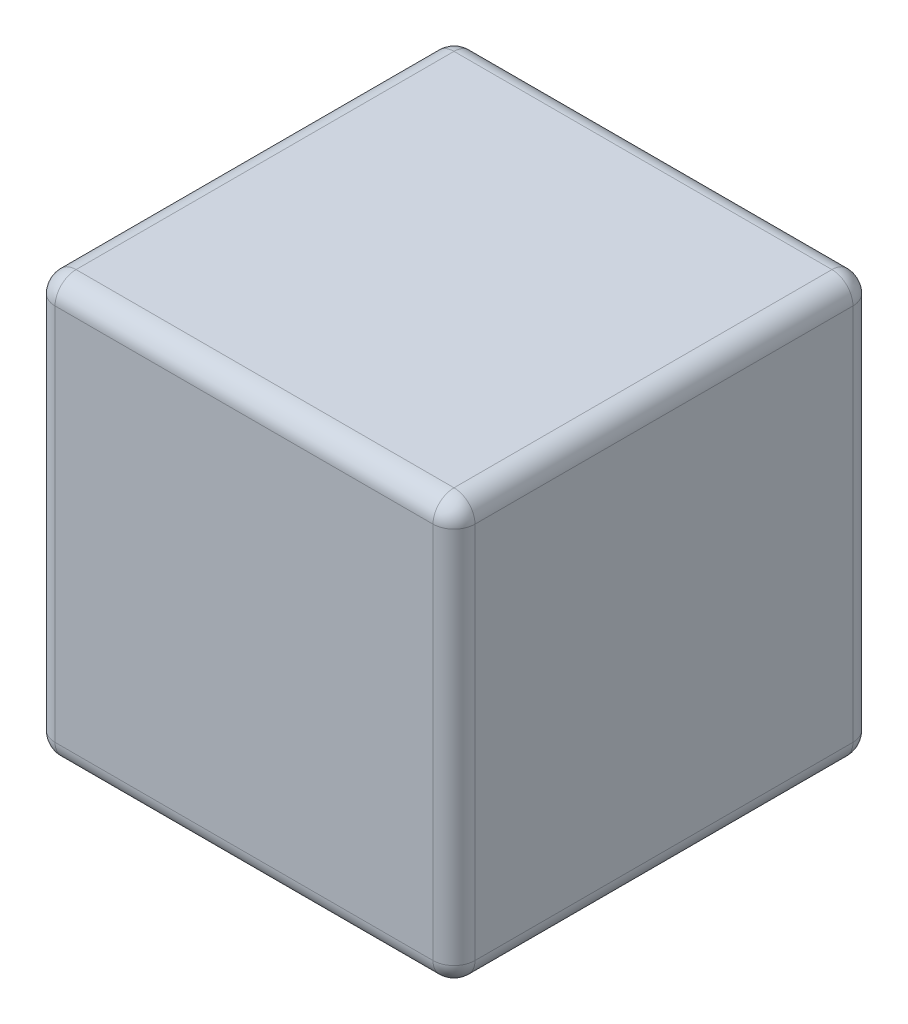
ISO-10303-21;
HEADER;
FILE_DESCRIPTION(('STEP AP214'),'2;1');
FILE_NAME('part.step','',(''),(''),'','','');
FILE_SCHEMA(('AUTOMOTIVE_DESIGN { 1 0 10303 214 1 1 1 1 }'));
ENDSEC;
DATA;
#1=APPLICATION_CONTEXT('core data for automotive mechanical design processes');
#2=APPLICATION_PROTOCOL_DEFINITION('international standard','automotive_design',2000,#1);
#3=PRODUCT_CONTEXT('',#1,'mechanical');
#4=PRODUCT('Part','Part','',(#3));
#5=PRODUCT_RELATED_PRODUCT_CATEGORY('part','',(#4));
#6=PRODUCT_DEFINITION_FORMATION('','',#4);
#7=PRODUCT_DEFINITION_CONTEXT('part definition',#1,'design');
#8=PRODUCT_DEFINITION('design','',#6,#7);
#9=PRODUCT_DEFINITION_SHAPE('','',#8);
#10=(LENGTH_UNIT() NAMED_UNIT(*) SI_UNIT(.MILLI.,.METRE.));
#11=(NAMED_UNIT(*) PLANE_ANGLE_UNIT() SI_UNIT($,.RADIAN.));
#12=(NAMED_UNIT(*) SI_UNIT($,.STERADIAN.) SOLID_ANGLE_UNIT());
#13=UNCERTAINTY_MEASURE_WITH_UNIT(LENGTH_MEASURE(1.E-05),#10,'distance_accuracy_value','');
#14=(GEOMETRIC_REPRESENTATION_CONTEXT(3) GLOBAL_UNCERTAINTY_ASSIGNED_CONTEXT((#13)) GLOBAL_UNIT_ASSIGNED_CONTEXT((#10,
#11,#12)) REPRESENTATION_CONTEXT('',''));
#15=CARTESIAN_POINT('',(0.,0.,0.));
#16=DIRECTION('',(0.,0.,1.));
#17=DIRECTION('',(1.,0.,0.));
#18=AXIS2_PLACEMENT_3D('',#15,#16,#17);
#19=CARTESIAN_POINT('',(0.,100.,0.));
#20=DIRECTION('',(1.,0.,0.));
#21=DIRECTION('',(0.,0.,-1.));
#22=AXIS2_PLACEMENT_3D('',#19,#20,#21);
#23=PLANE('',#22);
#24=DIRECTION('',(0.,0.,1.));
#25=VECTOR('',#24,1.);
#26=CARTESIAN_POINT('',(0.,95.,0.));
#27=LINE('',#26,#25);
#28=CARTESIAN_POINT('',(0.,95.,-5.));
#29=VERTEX_POINT('',#28);
#30=CARTESIAN_POINT('',(0.,95.,-95.));
#31=VERTEX_POINT('',#30);
#32=EDGE_CURVE('E195',#29,#31,#27,.F.);
#33=ORIENTED_EDGE('',*,*,#32,.T.);
#34=DIRECTION('',(0.,-1.,0.));
#35=VECTOR('',#34,1.);
#36=CARTESIAN_POINT('',(0.,100.,-95.));
#37=LINE('',#36,#35);
#38=CARTESIAN_POINT('',(0.,5.,-95.));
#39=VERTEX_POINT('',#38);
#40=EDGE_CURVE('E197',#31,#39,#37,.T.);
#41=ORIENTED_EDGE('',*,*,#40,.T.);
#42=DIRECTION('',(0.,0.,1.));
#43=VECTOR('',#42,1.);
#44=CARTESIAN_POINT('',(0.,5.,0.));
#45=LINE('',#44,#43);
#46=CARTESIAN_POINT('',(0.,5.,-5.));
#47=VERTEX_POINT('',#46);
#48=EDGE_CURVE('E193',#39,#47,#45,.T.);
#49=ORIENTED_EDGE('',*,*,#48,.T.);
#50=DIRECTION('',(0.,-1.,0.));
#51=VECTOR('',#50,1.);
#52=CARTESIAN_POINT('',(0.,100.,-5.));
#53=LINE('',#52,#51);
#54=EDGE_CURVE('E191',#47,#29,#53,.F.);
#55=ORIENTED_EDGE('',*,*,#54,.T.);
#56=EDGE_LOOP('',(#33,#41,#49,#55));
#57=FACE_BOUND('',#56,.T.);
#58=ADVANCED_FACE('F37',(#57),#23,.F.);
#59=CARTESIAN_POINT('',(0.,100.,0.));
#60=DIRECTION('',(0.,0.,-1.));
#61=DIRECTION('',(-1.,0.,0.));
#62=AXIS2_PLACEMENT_3D('',#59,#60,#61);
#63=PLANE('',#62);
#64=DIRECTION('',(1.,0.,0.));
#65=VECTOR('',#64,1.);
#66=CARTESIAN_POINT('',(0.,95.,0.));
#67=LINE('',#66,#65);
#68=CARTESIAN_POINT('',(95.,95.,0.));
#69=VERTEX_POINT('',#68);
#70=CARTESIAN_POINT('',(5.,95.,0.));
#71=VERTEX_POINT('',#70);
#72=EDGE_CURVE('E46',#69,#71,#67,.F.);
#73=ORIENTED_EDGE('',*,*,#72,.T.);
#74=DIRECTION('',(0.,-1.,0.));
#75=VECTOR('',#74,1.);
#76=CARTESIAN_POINT('',(5.,100.,0.));
#77=LINE('',#76,#75);
#78=CARTESIAN_POINT('',(5.,5.,0.));
#79=VERTEX_POINT('',#78);
#80=EDGE_CURVE('E11',#71,#79,#77,.T.);
#81=ORIENTED_EDGE('',*,*,#80,.T.);
#82=DIRECTION('',(1.,0.,0.));
#83=VECTOR('',#82,1.);
#84=CARTESIAN_POINT('',(100.,5.,0.));
#85=LINE('',#84,#83);
#86=CARTESIAN_POINT('',(95.,5.,0.));
#87=VERTEX_POINT('',#86);
#88=EDGE_CURVE('E200',#79,#87,#85,.T.);
#89=ORIENTED_EDGE('',*,*,#88,.T.);
#90=DIRECTION('',(0.,-1.,0.));
#91=VECTOR('',#90,1.);
#92=CARTESIAN_POINT('',(95.,100.,0.));
#93=LINE('',#92,#91);
#94=EDGE_CURVE('E57',#87,#69,#93,.F.);
#95=ORIENTED_EDGE('',*,*,#94,.T.);
#96=EDGE_LOOP('',(#73,#81,#89,#95));
#97=FACE_BOUND('',#96,.T.);
#98=ADVANCED_FACE('F352',(#97),#63,.F.);
#99=CARTESIAN_POINT('',(100.,100.,0.));
#100=DIRECTION('',(-1.,0.,0.));
#101=DIRECTION('',(0.,0.,1.));
#102=AXIS2_PLACEMENT_3D('',#99,#100,#101);
#103=PLANE('',#102);
#104=DIRECTION('',(0.,0.,-1.));
#105=VECTOR('',#104,1.);
#106=CARTESIAN_POINT('',(100.,5.,-100.));
#107=LINE('',#106,#105);
#108=CARTESIAN_POINT('',(100.,5.,-5.));
#109=VERTEX_POINT('',#108);
#110=CARTESIAN_POINT('',(100.,5.,-95.));
#111=VERTEX_POINT('',#110);
#112=EDGE_CURVE('E170',#109,#111,#107,.T.);
#113=ORIENTED_EDGE('',*,*,#112,.T.);
#114=DIRECTION('',(0.,-1.,0.));
#115=VECTOR('',#114,1.);
#116=CARTESIAN_POINT('',(100.,100.,-95.));
#117=LINE('',#116,#115);
#118=CARTESIAN_POINT('',(100.,95.,-95.));
#119=VERTEX_POINT('',#118);
#120=EDGE_CURVE('E132',#111,#119,#117,.F.);
#121=ORIENTED_EDGE('',*,*,#120,.T.);
#122=DIRECTION('',(0.,0.,-1.));
#123=VECTOR('',#122,1.);
#124=CARTESIAN_POINT('',(100.,95.,0.));
#125=LINE('',#124,#123);
#126=CARTESIAN_POINT('',(100.,95.,-5.));
#127=VERTEX_POINT('',#126);
#128=EDGE_CURVE('E164',#119,#127,#125,.F.);
#129=ORIENTED_EDGE('',*,*,#128,.T.);
#130=DIRECTION('',(0.,-1.,0.));
#131=VECTOR('',#130,1.);
#132=CARTESIAN_POINT('',(100.,100.,-5.));
#133=LINE('',#132,#131);
#134=EDGE_CURVE('E162',#127,#109,#133,.T.);
#135=ORIENTED_EDGE('',*,*,#134,.T.);
#136=EDGE_LOOP('',(#113,#121,#129,#135));
#137=FACE_BOUND('',#136,.T.);
#138=ADVANCED_FACE('F322',(#137),#103,.F.);
#139=CARTESIAN_POINT('',(0.,100.,-100.));
#140=DIRECTION('',(0.,0.,1.));
#141=DIRECTION('',(1.,0.,0.));
#142=AXIS2_PLACEMENT_3D('',#139,#140,#141);
#143=PLANE('',#142);
#144=DIRECTION('',(-1.,0.,0.));
#145=VECTOR('',#144,1.);
#146=CARTESIAN_POINT('',(0.,95.,-100.));
#147=LINE('',#146,#145);
#148=CARTESIAN_POINT('',(4.99999999999997,95.,-100.));
#149=VERTEX_POINT('',#148);
#150=CARTESIAN_POINT('',(95.,95.,-100.));
#151=VERTEX_POINT('',#150);
#152=EDGE_CURVE('E160',#149,#151,#147,.F.);
#153=ORIENTED_EDGE('',*,*,#152,.T.);
#154=DIRECTION('',(0.,-1.,0.));
#155=VECTOR('',#154,1.);
#156=CARTESIAN_POINT('',(95.,100.,-100.));
#157=LINE('',#156,#155);
#158=CARTESIAN_POINT('',(95.,5.,-100.));
#159=VERTEX_POINT('',#158);
#160=EDGE_CURVE('E130',#151,#159,#157,.T.);
#161=ORIENTED_EDGE('',*,*,#160,.T.);
#162=DIRECTION('',(-1.,0.,0.));
#163=VECTOR('',#162,1.);
#164=CARTESIAN_POINT('',(0.,5.,-100.));
#165=LINE('',#164,#163);
#166=CARTESIAN_POINT('',(4.99999999999997,5.,-100.));
#167=VERTEX_POINT('',#166);
#168=EDGE_CURVE('E148',#159,#167,#165,.T.);
#169=ORIENTED_EDGE('',*,*,#168,.T.);
#170=DIRECTION('',(0.,-1.,0.));
#171=VECTOR('',#170,1.);
#172=CARTESIAN_POINT('',(4.99999999999997,100.,-100.));
#173=LINE('',#172,#171);
#174=EDGE_CURVE('E154',#167,#149,#173,.F.);
#175=ORIENTED_EDGE('',*,*,#174,.T.);
#176=EDGE_LOOP('',(#153,#161,#169,#175));
#177=FACE_BOUND('',#176,.T.);
#178=CARTESIAN_POINT('',(50.,50.,-100.));
#179=DIRECTION('',(0.,0.,-1.));
#180=DIRECTION('',(-1.,0.,0.));
#181=AXIS2_PLACEMENT_3D('',#178,#179,#180);
#182=CIRCLE('',#181,10.);
#183=CARTESIAN_POINT('',(40.,50.,-100.));
#184=VERTEX_POINT('',#183);
#185=EDGE_CURVE('E292',#184,#184,#182,.T.);
#186=ORIENTED_EDGE('',*,*,#185,.F.);
#187=EDGE_LOOP('',(#186));
#188=FACE_BOUND('',#187,.T.);
#189=ADVANCED_FACE('F157',(#177,#188),#143,.F.);
#190=CARTESIAN_POINT('',(0.,100.,0.));
#191=DIRECTION('',(0.,-1.,0.));
#192=DIRECTION('',(0.,0.,-1.));
#193=AXIS2_PLACEMENT_3D('',#190,#191,#192);
#194=PLANE('',#193);
#195=DIRECTION('',(0.,0.,-1.));
#196=VECTOR('',#195,1.);
#197=CARTESIAN_POINT('',(95.,100.,0.));
#198=LINE('',#197,#196);
#199=CARTESIAN_POINT('',(95.,100.,-5.));
#200=VERTEX_POINT('',#199);
#201=CARTESIAN_POINT('',(95.,100.,-95.));
#202=VERTEX_POINT('',#201);
#203=EDGE_CURVE('E186',#200,#202,#198,.T.);
#204=ORIENTED_EDGE('',*,*,#203,.T.);
#205=DIRECTION('',(-1.,0.,0.));
#206=VECTOR('',#205,1.);
#207=CARTESIAN_POINT('',(0.,100.,-95.));
#208=LINE('',#207,#206);
#209=CARTESIAN_POINT('',(4.99999999999997,100.,-95.));
#210=VERTEX_POINT('',#209);
#211=EDGE_CURVE('E188',#202,#210,#208,.T.);
#212=ORIENTED_EDGE('',*,*,#211,.T.);
#213=DIRECTION('',(0.,0.,1.));
#214=VECTOR('',#213,1.);
#215=CARTESIAN_POINT('',(5.,100.,0.));
#216=LINE('',#215,#214);
#217=CARTESIAN_POINT('',(5.,100.,-5.));
#218=VERTEX_POINT('',#217);
#219=EDGE_CURVE('E184',#210,#218,#216,.T.);
#220=ORIENTED_EDGE('',*,*,#219,.T.);
#221=DIRECTION('',(1.,0.,0.));
#222=VECTOR('',#221,1.);
#223=CARTESIAN_POINT('',(0.,100.,-5.));
#224=LINE('',#223,#222);
#225=EDGE_CURVE('E182',#218,#200,#224,.T.);
#226=ORIENTED_EDGE('',*,*,#225,.T.);
#227=EDGE_LOOP('',(#204,#212,#220,#226));
#228=FACE_BOUND('',#227,.T.);
#229=ADVANCED_FACE('F625',(#228),#194,.F.);
#230=CARTESIAN_POINT('',(0.,0.,0.));
#231=DIRECTION('',(0.,-1.,0.));
#232=DIRECTION('',(0.,0.,-1.));
#233=AXIS2_PLACEMENT_3D('',#230,#231,#232);
#234=PLANE('',#233);
#235=DIRECTION('',(0.,0.,-1.));
#236=VECTOR('',#235,1.);
#237=CARTESIAN_POINT('',(95.,0.,0.));
#238=LINE('',#237,#236);
#239=CARTESIAN_POINT('',(95.,0.,-95.));
#240=VERTEX_POINT('',#239);
#241=CARTESIAN_POINT('',(95.,0.,-5.));
#242=VERTEX_POINT('',#241);
#243=EDGE_CURVE('E177',#240,#242,#238,.F.);
#244=ORIENTED_EDGE('',*,*,#243,.T.);
#245=DIRECTION('',(1.,0.,0.));
#246=VECTOR('',#245,1.);
#247=CARTESIAN_POINT('',(0.,0.,-5.));
#248=LINE('',#247,#246);
#249=CARTESIAN_POINT('',(5.,0.,-5.));
#250=VERTEX_POINT('',#249);
#251=EDGE_CURVE('E180',#242,#250,#248,.F.);
#252=ORIENTED_EDGE('',*,*,#251,.T.);
#253=DIRECTION('',(0.,0.,1.));
#254=VECTOR('',#253,1.);
#255=CARTESIAN_POINT('',(4.99999999999997,0.,-100.));
#256=LINE('',#255,#254);
#257=CARTESIAN_POINT('',(4.99999999999997,0.,-95.));
#258=VERTEX_POINT('',#257);
#259=EDGE_CURVE('E175',#250,#258,#256,.F.);
#260=ORIENTED_EDGE('',*,*,#259,.T.);
#261=DIRECTION('',(-1.,0.,0.));
#262=VECTOR('',#261,1.);
#263=CARTESIAN_POINT('',(100.,0.,-95.));
#264=LINE('',#263,#262);
#265=EDGE_CURVE('E173',#258,#240,#264,.F.);
#266=ORIENTED_EDGE('',*,*,#265,.T.);
#267=EDGE_LOOP('',(#244,#252,#260,#266));
#268=FACE_BOUND('',#267,.T.);
#269=CARTESIAN_POINT('',(21.7157287525381,0.,-21.7157287525381));
#270=DIRECTION('',(0.,-1.,0.));
#271=DIRECTION('',(0.,0.,-1.));
#272=AXIS2_PLACEMENT_3D('',#269,#270,#271);
#273=CIRCLE('',#272,9.99999999999999);
#274=CARTESIAN_POINT('',(21.7157287525381,0.,-31.7157287525381));
#275=VERTEX_POINT('',#274);
#276=EDGE_CURVE('E279',#275,#275,#273,.T.);
#277=ORIENTED_EDGE('',*,*,#276,.F.);
#278=EDGE_LOOP('',(#277));
#279=FACE_BOUND('',#278,.T.);
#280=CARTESIAN_POINT('',(78.2842712474619,0.,-78.2842712474619));
#281=DIRECTION('',(0.,-1.,0.));
#282=DIRECTION('',(0.,0.,-1.));
#283=AXIS2_PLACEMENT_3D('',#280,#281,#282);
#284=CIRCLE('',#283,9.99999999999999);
#285=CARTESIAN_POINT('',(78.2842712474619,0.,-88.2842712474619));
#286=VERTEX_POINT('',#285);
#287=EDGE_CURVE('E285',#286,#286,#284,.T.);
#288=ORIENTED_EDGE('',*,*,#287,.F.);
#289=EDGE_LOOP('',(#288));
#290=FACE_BOUND('',#289,.T.);
#291=CARTESIAN_POINT('',(78.2842712474619,0.,-21.7157287525381));
#292=DIRECTION('',(0.,-1.,0.));
#293=DIRECTION('',(0.,0.,-1.));
#294=AXIS2_PLACEMENT_3D('',#291,#292,#293);
#295=CIRCLE('',#294,9.99999999999999);
#296=CARTESIAN_POINT('',(78.2842712474619,0.,-31.7157287525381));
#297=VERTEX_POINT('',#296);
#298=EDGE_CURVE('E271',#297,#297,#295,.T.);
#299=ORIENTED_EDGE('',*,*,#298,.F.);
#300=EDGE_LOOP('',(#299));
#301=FACE_BOUND('',#300,.T.);
#302=CARTESIAN_POINT('',(50.,0.,-50.));
#303=DIRECTION('',(0.,-1.,0.));
#304=DIRECTION('',(0.,0.,-1.));
#305=AXIS2_PLACEMENT_3D('',#302,#303,#304);
#306=CIRCLE('',#305,10.);
#307=CARTESIAN_POINT('',(50.,0.,-60.));
#308=VERTEX_POINT('',#307);
#309=EDGE_CURVE('E260',#308,#308,#306,.T.);
#310=ORIENTED_EDGE('',*,*,#309,.F.);
#311=EDGE_LOOP('',(#310));
#312=FACE_BOUND('',#311,.T.);
#313=CARTESIAN_POINT('',(21.7157287525381,0.,-78.2842712474619));
#314=DIRECTION('',(0.,-1.,0.));
#315=DIRECTION('',(0.,0.,-1.));
#316=AXIS2_PLACEMENT_3D('',#313,#314,#315);
#317=CIRCLE('',#316,10.);
#318=CARTESIAN_POINT('',(21.7157287525381,0.,-88.2842712474619));
#319=VERTEX_POINT('',#318);
#320=EDGE_CURVE('E278',#319,#319,#317,.T.);
#321=ORIENTED_EDGE('',*,*,#320,.F.);
#322=EDGE_LOOP('',(#321));
#323=FACE_BOUND('',#322,.T.);
#324=ADVANCED_FACE('F330',(#268,#279,#290,#301,#312,#323),#234,.T.);
#325=CARTESIAN_POINT('',(50.,50.,-90.));
#326=DIRECTION('',(0.,0.,-1.));
#327=DIRECTION('',(-1.,0.,0.));
#328=AXIS2_PLACEMENT_3D('',#325,#326,#327);
#329=CYLINDRICAL_SURFACE('',#328,10.);
#330=CARTESIAN_POINT('',(50.,50.,-90.));
#331=DIRECTION('',(0.,0.,-1.));
#332=DIRECTION('',(-1.,0.,0.));
#333=AXIS2_PLACEMENT_3D('',#330,#331,#332);
#334=CIRCLE('',#333,10.);
#335=CARTESIAN_POINT('',(40.,50.,-90.));
#336=VERTEX_POINT('',#335);
#337=EDGE_CURVE('E155',#336,#336,#334,.T.);
#338=ORIENTED_EDGE('',*,*,#337,.F.);
#339=EDGE_LOOP('',(#338));
#340=FACE_BOUND('',#339,.T.);
#341=ORIENTED_EDGE('',*,*,#185,.T.);
#342=EDGE_LOOP('',(#341));
#343=FACE_BOUND('',#342,.T.);
#344=ADVANCED_FACE('F609',(#340,#343),#329,.F.);
#345=CARTESIAN_POINT('',(50.,50.,-90.));
#346=DIRECTION('',(0.,0.,-1.));
#347=DIRECTION('',(-1.,0.,0.));
#348=AXIS2_PLACEMENT_3D('',#345,#346,#347);
#349=PLANE('',#348);
#350=ORIENTED_EDGE('',*,*,#337,.T.);
#351=EDGE_LOOP('',(#350));
#352=FACE_BOUND('',#351,.T.);
#353=ADVANCED_FACE('F600',(#352),#349,.T.);
#354=CARTESIAN_POINT('',(21.7157287525381,10.,-78.2842712474619));
#355=DIRECTION('',(0.,-1.,0.));
#356=DIRECTION('',(0.,0.,-1.));
#357=AXIS2_PLACEMENT_3D('',#354,#355,#356);
#358=CYLINDRICAL_SURFACE('',#357,10.);
#359=CARTESIAN_POINT('',(21.7157287525381,10.,-78.2842712474619));
#360=DIRECTION('',(0.,-1.,0.));
#361=DIRECTION('',(0.,0.,-1.));
#362=AXIS2_PLACEMENT_3D('',#359,#360,#361);
#363=CIRCLE('',#362,10.);
#364=CARTESIAN_POINT('',(21.7157287525381,10.,-88.2842712474619));
#365=VERTEX_POINT('',#364);
#366=EDGE_CURVE('E289',#365,#365,#363,.T.);
#367=ORIENTED_EDGE('',*,*,#366,.F.);
#368=EDGE_LOOP('',(#367));
#369=FACE_BOUND('',#368,.T.);
#370=ORIENTED_EDGE('',*,*,#320,.T.);
#371=EDGE_LOOP('',(#370));
#372=FACE_BOUND('',#371,.T.);
#373=ADVANCED_FACE('F591',(#369,#372),#358,.F.);
#374=CARTESIAN_POINT('',(21.7157287525381,10.,-78.2842712474619));
#375=DIRECTION('',(0.,-1.,0.));
#376=DIRECTION('',(0.,0.,-1.));
#377=AXIS2_PLACEMENT_3D('',#374,#375,#376);
#378=PLANE('',#377);
#379=ORIENTED_EDGE('',*,*,#366,.T.);
#380=EDGE_LOOP('',(#379));
#381=FACE_BOUND('',#380,.T.);
#382=ADVANCED_FACE('F582',(#381),#378,.T.);
#383=CARTESIAN_POINT('',(50.,10.,-50.));
#384=DIRECTION('',(0.,-1.,0.));
#385=DIRECTION('',(0.,0.,-1.));
#386=AXIS2_PLACEMENT_3D('',#383,#384,#385);
#387=CYLINDRICAL_SURFACE('',#386,10.);
#388=CARTESIAN_POINT('',(50.,10.,-50.));
#389=DIRECTION('',(0.,-1.,0.));
#390=DIRECTION('',(0.,0.,-1.));
#391=AXIS2_PLACEMENT_3D('',#388,#389,#390);
#392=CIRCLE('',#391,10.);
#393=CARTESIAN_POINT('',(50.,10.,-60.));
#394=VERTEX_POINT('',#393);
#395=EDGE_CURVE('E266',#394,#394,#392,.T.);
#396=ORIENTED_EDGE('',*,*,#395,.F.);
#397=EDGE_LOOP('',(#396));
#398=FACE_BOUND('',#397,.T.);
#399=ORIENTED_EDGE('',*,*,#309,.T.);
#400=EDGE_LOOP('',(#399));
#401=FACE_BOUND('',#400,.T.);
#402=ADVANCED_FACE('F573',(#398,#401),#387,.F.);
#403=CARTESIAN_POINT('',(50.,10.,-50.));
#404=DIRECTION('',(0.,-1.,0.));
#405=DIRECTION('',(0.,0.,-1.));
#406=AXIS2_PLACEMENT_3D('',#403,#404,#405);
#407=PLANE('',#406);
#408=ORIENTED_EDGE('',*,*,#395,.T.);
#409=EDGE_LOOP('',(#408));
#410=FACE_BOUND('',#409,.T.);
#411=ADVANCED_FACE('F564',(#410),#407,.T.);
#412=CARTESIAN_POINT('',(78.2842712474619,10.,-21.7157287525381));
#413=DIRECTION('',(0.,-1.,0.));
#414=DIRECTION('',(0.,0.,-1.));
#415=AXIS2_PLACEMENT_3D('',#412,#413,#414);
#416=CYLINDRICAL_SURFACE('',#415,9.99999999999999);
#417=CARTESIAN_POINT('',(78.2842712474619,10.,-21.7157287525381));
#418=DIRECTION('',(0.,-1.,0.));
#419=DIRECTION('',(0.,0.,-1.));
#420=AXIS2_PLACEMENT_3D('',#417,#418,#419);
#421=CIRCLE('',#420,9.99999999999999);
#422=CARTESIAN_POINT('',(78.2842712474619,10.,-31.7157287525381));
#423=VERTEX_POINT('',#422);
#424=EDGE_CURVE('E288',#423,#423,#421,.T.);
#425=ORIENTED_EDGE('',*,*,#424,.F.);
#426=EDGE_LOOP('',(#425));
#427=FACE_BOUND('',#426,.T.);
#428=ORIENTED_EDGE('',*,*,#298,.T.);
#429=EDGE_LOOP('',(#428));
#430=FACE_BOUND('',#429,.T.);
#431=ADVANCED_FACE('F555',(#427,#430),#416,.F.);
#432=CARTESIAN_POINT('',(78.2842712474619,10.,-21.7157287525381));
#433=DIRECTION('',(0.,-1.,0.));
#434=DIRECTION('',(0.,0.,-1.));
#435=AXIS2_PLACEMENT_3D('',#432,#433,#434);
#436=PLANE('',#435);
#437=ORIENTED_EDGE('',*,*,#424,.T.);
#438=EDGE_LOOP('',(#437));
#439=FACE_BOUND('',#438,.T.);
#440=ADVANCED_FACE('F546',(#439),#436,.T.);
#441=CARTESIAN_POINT('',(78.2842712474619,10.,-78.2842712474619));
#442=DIRECTION('',(0.,-1.,0.));
#443=DIRECTION('',(0.,0.,-1.));
#444=AXIS2_PLACEMENT_3D('',#441,#442,#443);
#445=CYLINDRICAL_SURFACE('',#444,9.99999999999999);
#446=CARTESIAN_POINT('',(78.2842712474619,10.,-78.2842712474619));
#447=DIRECTION('',(0.,-1.,0.));
#448=DIRECTION('',(0.,0.,-1.));
#449=AXIS2_PLACEMENT_3D('',#446,#447,#448);
#450=CIRCLE('',#449,9.99999999999999);
#451=CARTESIAN_POINT('',(78.2842712474619,10.,-88.2842712474619));
#452=VERTEX_POINT('',#451);
#453=EDGE_CURVE('E282',#452,#452,#450,.T.);
#454=ORIENTED_EDGE('',*,*,#453,.F.);
#455=EDGE_LOOP('',(#454));
#456=FACE_BOUND('',#455,.T.);
#457=ORIENTED_EDGE('',*,*,#287,.T.);
#458=EDGE_LOOP('',(#457));
#459=FACE_BOUND('',#458,.T.);
#460=ADVANCED_FACE('F537',(#456,#459),#445,.F.);
#461=CARTESIAN_POINT('',(78.2842712474619,10.,-78.2842712474619));
#462=DIRECTION('',(0.,-1.,0.));
#463=DIRECTION('',(0.,0.,-1.));
#464=AXIS2_PLACEMENT_3D('',#461,#462,#463);
#465=PLANE('',#464);
#466=ORIENTED_EDGE('',*,*,#453,.T.);
#467=EDGE_LOOP('',(#466));
#468=FACE_BOUND('',#467,.T.);
#469=ADVANCED_FACE('F528',(#468),#465,.T.);
#470=CARTESIAN_POINT('',(21.7157287525381,10.,-21.7157287525381));
#471=DIRECTION('',(0.,-1.,0.));
#472=DIRECTION('',(0.,0.,-1.));
#473=AXIS2_PLACEMENT_3D('',#470,#471,#472);
#474=CYLINDRICAL_SURFACE('',#473,9.99999999999999);
#475=CARTESIAN_POINT('',(21.7157287525381,10.,-21.7157287525381));
#476=DIRECTION('',(0.,-1.,0.));
#477=DIRECTION('',(0.,0.,-1.));
#478=AXIS2_PLACEMENT_3D('',#475,#476,#477);
#479=CIRCLE('',#478,9.99999999999999);
#480=CARTESIAN_POINT('',(21.7157287525381,10.,-31.7157287525381));
#481=VERTEX_POINT('',#480);
#482=EDGE_CURVE('E275',#481,#481,#479,.T.);
#483=ORIENTED_EDGE('',*,*,#482,.F.);
#484=EDGE_LOOP('',(#483));
#485=FACE_BOUND('',#484,.T.);
#486=ORIENTED_EDGE('',*,*,#276,.T.);
#487=EDGE_LOOP('',(#486));
#488=FACE_BOUND('',#487,.T.);
#489=ADVANCED_FACE('F519',(#485,#488),#474,.F.);
#490=CARTESIAN_POINT('',(21.7157287525381,10.,-21.7157287525381));
#491=DIRECTION('',(0.,-1.,0.));
#492=DIRECTION('',(0.,0.,-1.));
#493=AXIS2_PLACEMENT_3D('',#490,#491,#492);
#494=PLANE('',#493);
#495=ORIENTED_EDGE('',*,*,#482,.T.);
#496=EDGE_LOOP('',(#495));
#497=FACE_BOUND('',#496,.T.);
#498=ADVANCED_FACE('F510',(#497),#494,.T.);
#499=CARTESIAN_POINT('',(5.,100.,-5.));
#500=DIRECTION('',(0.,-1.,0.));
#501=DIRECTION('',(0.,0.,-1.));
#502=AXIS2_PLACEMENT_3D('',#499,#500,#501);
#503=CYLINDRICAL_SURFACE('',#502,5.);
#504=CARTESIAN_POINT('',(5.,95.,-5.));
#505=DIRECTION('',(0.,1.,0.));
#506=DIRECTION('',(0.,0.,1.));
#507=AXIS2_PLACEMENT_3D('',#504,#505,#506);
#508=CIRCLE('',#507,5.);
#509=EDGE_CURVE('E41',#29,#71,#508,.T.);
#510=ORIENTED_EDGE('',*,*,#509,.F.);
#511=ORIENTED_EDGE('',*,*,#54,.F.);
#512=CARTESIAN_POINT('',(5.,5.,-5.));
#513=DIRECTION('',(0.,-1.,0.));
#514=DIRECTION('',(0.,0.,-1.));
#515=AXIS2_PLACEMENT_3D('',#512,#513,#514);
#516=CIRCLE('',#515,5.);
#517=EDGE_CURVE('E253',#79,#47,#516,.T.);
#518=ORIENTED_EDGE('',*,*,#517,.F.);
#519=ORIENTED_EDGE('',*,*,#80,.F.);
#520=EDGE_LOOP('',(#510,#511,#518,#519));
#521=FACE_BOUND('',#520,.T.);
#522=ADVANCED_FACE('F39',(#521),#503,.T.);
#523=CARTESIAN_POINT('',(5.,95.,-5.));
#524=DIRECTION('',(0.,0.,1.));
#525=DIRECTION('',(1.,0.,0.));
#526=AXIS2_PLACEMENT_3D('',#523,#524,#525);
#527=SPHERICAL_SURFACE('',#526,5.);
#528=CARTESIAN_POINT('',(5.,95.,-5.));
#529=DIRECTION('',(0.,0.,1.));
#530=DIRECTION('',(1.,0.,0.));
#531=AXIS2_PLACEMENT_3D('',#528,#529,#530);
#532=CIRCLE('',#531,5.);
#533=EDGE_CURVE('E248',#29,#218,#532,.F.);
#534=ORIENTED_EDGE('',*,*,#533,.F.);
#535=ORIENTED_EDGE('',*,*,#509,.T.);
#536=CARTESIAN_POINT('',(5.,95.,-5.));
#537=DIRECTION('',(-1.,0.,0.));
#538=DIRECTION('',(0.,0.,1.));
#539=AXIS2_PLACEMENT_3D('',#536,#537,#538);
#540=CIRCLE('',#539,5.);
#541=EDGE_CURVE('E251',#218,#71,#540,.F.);
#542=ORIENTED_EDGE('',*,*,#541,.F.);
#543=EDGE_LOOP('',(#534,#535,#542));
#544=FACE_BOUND('',#543,.T.);
#545=ADVANCED_FACE('F496',(#544),#527,.T.);
#546=CARTESIAN_POINT('',(5.,5.,-5.));
#547=DIRECTION('',(0.,0.,1.));
#548=DIRECTION('',(1.,0.,0.));
#549=AXIS2_PLACEMENT_3D('',#546,#547,#548);
#550=SPHERICAL_SURFACE('',#549,5.);
#551=CARTESIAN_POINT('',(5.,5.,-5.));
#552=DIRECTION('',(-1.,0.,0.));
#553=DIRECTION('',(0.,0.,1.));
#554=AXIS2_PLACEMENT_3D('',#551,#552,#553);
#555=CIRCLE('',#554,5.);
#556=EDGE_CURVE('E242',#79,#250,#555,.F.);
#557=ORIENTED_EDGE('',*,*,#556,.F.);
#558=ORIENTED_EDGE('',*,*,#517,.T.);
#559=CARTESIAN_POINT('',(5.,5.,-5.));
#560=DIRECTION('',(0.,0.,1.));
#561=DIRECTION('',(1.,0.,0.));
#562=AXIS2_PLACEMENT_3D('',#559,#560,#561);
#563=CIRCLE('',#562,5.);
#564=EDGE_CURVE('E245',#250,#47,#563,.F.);
#565=ORIENTED_EDGE('',*,*,#564,.F.);
#566=EDGE_LOOP('',(#557,#558,#565));
#567=FACE_BOUND('',#566,.T.);
#568=ADVANCED_FACE('F487',(#567),#550,.T.);
#569=CARTESIAN_POINT('',(0.,95.,-5.));
#570=DIRECTION('',(1.,0.,0.));
#571=DIRECTION('',(0.,0.,-1.));
#572=AXIS2_PLACEMENT_3D('',#569,#570,#571);
#573=CYLINDRICAL_SURFACE('',#572,5.);
#574=ORIENTED_EDGE('',*,*,#541,.T.);
#575=ORIENTED_EDGE('',*,*,#72,.F.);
#576=CARTESIAN_POINT('',(95.,95.,-5.));
#577=DIRECTION('',(1.,0.,0.));
#578=DIRECTION('',(0.,0.,-1.));
#579=AXIS2_PLACEMENT_3D('',#576,#577,#578);
#580=CIRCLE('',#579,5.);
#581=EDGE_CURVE('E236',#200,#69,#580,.T.);
#582=ORIENTED_EDGE('',*,*,#581,.F.);
#583=ORIENTED_EDGE('',*,*,#225,.F.);
#584=EDGE_LOOP('',(#574,#575,#582,#583));
#585=FACE_BOUND('',#584,.T.);
#586=ADVANCED_FACE('F478',(#585),#573,.T.);
#587=CARTESIAN_POINT('',(5.,95.,0.));
#588=DIRECTION('',(0.,0.,1.));
#589=DIRECTION('',(1.,0.,0.));
#590=AXIS2_PLACEMENT_3D('',#587,#588,#589);
#591=CYLINDRICAL_SURFACE('',#590,5.);
#592=ORIENTED_EDGE('',*,*,#533,.T.);
#593=ORIENTED_EDGE('',*,*,#219,.F.);
#594=CARTESIAN_POINT('',(4.99999999999997,95.,-95.));
#595=DIRECTION('',(0.,0.,-1.));
#596=DIRECTION('',(-1.,0.,0.));
#597=AXIS2_PLACEMENT_3D('',#594,#595,#596);
#598=CIRCLE('',#597,5.);
#599=EDGE_CURVE('E233',#31,#210,#598,.T.);
#600=ORIENTED_EDGE('',*,*,#599,.F.);
#601=ORIENTED_EDGE('',*,*,#32,.F.);
#602=EDGE_LOOP('',(#592,#593,#600,#601));
#603=FACE_BOUND('',#602,.T.);
#604=ADVANCED_FACE('F470',(#603),#591,.T.);
#605=CARTESIAN_POINT('',(4.99999999999997,100.,-95.));
#606=DIRECTION('',(0.,-1.,0.));
#607=DIRECTION('',(0.,0.,-1.));
#608=AXIS2_PLACEMENT_3D('',#605,#606,#607);
#609=CYLINDRICAL_SURFACE('',#608,5.);
#610=CARTESIAN_POINT('',(4.99999999999997,5.,-95.));
#611=DIRECTION('',(0.,-1.,0.));
#612=DIRECTION('',(0.,0.,-1.));
#613=AXIS2_PLACEMENT_3D('',#610,#611,#612);
#614=CIRCLE('',#613,5.);
#615=EDGE_CURVE('E227',#39,#167,#614,.T.);
#616=ORIENTED_EDGE('',*,*,#615,.F.);
#617=ORIENTED_EDGE('',*,*,#40,.F.);
#618=CARTESIAN_POINT('',(4.99999999999997,95.,-95.));
#619=DIRECTION('',(0.,1.,0.));
#620=DIRECTION('',(0.,0.,1.));
#621=AXIS2_PLACEMENT_3D('',#618,#619,#620);
#622=CIRCLE('',#621,5.);
#623=EDGE_CURVE('E230',#149,#31,#622,.T.);
#624=ORIENTED_EDGE('',*,*,#623,.F.);
#625=ORIENTED_EDGE('',*,*,#174,.F.);
#626=EDGE_LOOP('',(#616,#617,#624,#625));
#627=FACE_BOUND('',#626,.T.);
#628=ADVANCED_FACE('F303',(#627),#609,.T.);
#629=CARTESIAN_POINT('',(5.,5.,0.));
#630=DIRECTION('',(0.,0.,-1.));
#631=DIRECTION('',(-1.,0.,0.));
#632=AXIS2_PLACEMENT_3D('',#629,#630,#631);
#633=CYLINDRICAL_SURFACE('',#632,5.);
#634=ORIENTED_EDGE('',*,*,#564,.T.);
#635=ORIENTED_EDGE('',*,*,#48,.F.);
#636=CARTESIAN_POINT('',(4.99999999999997,5.,-95.));
#637=DIRECTION('',(0.,0.,-1.));
#638=DIRECTION('',(-1.,0.,0.));
#639=AXIS2_PLACEMENT_3D('',#636,#637,#638);
#640=CIRCLE('',#639,5.);
#641=EDGE_CURVE('E225',#258,#39,#640,.T.);
#642=ORIENTED_EDGE('',*,*,#641,.F.);
#643=ORIENTED_EDGE('',*,*,#259,.F.);
#644=EDGE_LOOP('',(#634,#635,#642,#643));
#645=FACE_BOUND('',#644,.T.);
#646=ADVANCED_FACE('F337',(#645),#633,.T.);
#647=CARTESIAN_POINT('',(0.,5.,-5.));
#648=DIRECTION('',(-1.,0.,0.));
#649=DIRECTION('',(0.,0.,1.));
#650=AXIS2_PLACEMENT_3D('',#647,#648,#649);
#651=CYLINDRICAL_SURFACE('',#650,5.);
#652=ORIENTED_EDGE('',*,*,#556,.T.);
#653=ORIENTED_EDGE('',*,*,#251,.F.);
#654=CARTESIAN_POINT('',(95.,5.,-5.));
#655=DIRECTION('',(1.,0.,0.));
#656=DIRECTION('',(0.,0.,-1.));
#657=AXIS2_PLACEMENT_3D('',#654,#655,#656);
#658=CIRCLE('',#657,5.);
#659=EDGE_CURVE('E222',#87,#242,#658,.T.);
#660=ORIENTED_EDGE('',*,*,#659,.F.);
#661=ORIENTED_EDGE('',*,*,#88,.F.);
#662=EDGE_LOOP('',(#652,#653,#660,#661));
#663=FACE_BOUND('',#662,.T.);
#664=ADVANCED_FACE('F446',(#663),#651,.T.);
#665=CARTESIAN_POINT('',(95.,100.,-5.));
#666=DIRECTION('',(0.,-1.,0.));
#667=DIRECTION('',(0.,0.,-1.));
#668=AXIS2_PLACEMENT_3D('',#665,#666,#667);
#669=CYLINDRICAL_SURFACE('',#668,5.);
#670=CARTESIAN_POINT('',(95.,95.,-5.));
#671=DIRECTION('',(0.,1.,0.));
#672=DIRECTION('',(0.,0.,1.));
#673=AXIS2_PLACEMENT_3D('',#670,#671,#672);
#674=CIRCLE('',#673,5.);
#675=EDGE_CURVE('E239',#69,#127,#674,.T.);
#676=ORIENTED_EDGE('',*,*,#675,.F.);
#677=ORIENTED_EDGE('',*,*,#94,.F.);
#678=CARTESIAN_POINT('',(95.,5.,-5.));
#679=DIRECTION('',(0.,-1.,0.));
#680=DIRECTION('',(0.,0.,-1.));
#681=AXIS2_PLACEMENT_3D('',#678,#679,#680);
#682=CIRCLE('',#681,5.);
#683=EDGE_CURVE('E219',#109,#87,#682,.T.);
#684=ORIENTED_EDGE('',*,*,#683,.F.);
#685=ORIENTED_EDGE('',*,*,#134,.F.);
#686=EDGE_LOOP('',(#676,#677,#684,#685));
#687=FACE_BOUND('',#686,.T.);
#688=ADVANCED_FACE('F437',(#687),#669,.T.);
#689=CARTESIAN_POINT('',(95.,95.,-5.));
#690=DIRECTION('',(0.,0.,1.));
#691=DIRECTION('',(1.,0.,0.));
#692=AXIS2_PLACEMENT_3D('',#689,#690,#691);
#693=SPHERICAL_SURFACE('',#692,5.);
#694=ORIENTED_EDGE('',*,*,#581,.T.);
#695=ORIENTED_EDGE('',*,*,#675,.T.);
#696=CARTESIAN_POINT('',(95.,95.,-5.));
#697=DIRECTION('',(0.,0.,1.));
#698=DIRECTION('',(1.,0.,0.));
#699=AXIS2_PLACEMENT_3D('',#696,#697,#698);
#700=CIRCLE('',#699,5.);
#701=EDGE_CURVE('E216',#200,#127,#700,.F.);
#702=ORIENTED_EDGE('',*,*,#701,.F.);
#703=EDGE_LOOP('',(#694,#695,#702));
#704=FACE_BOUND('',#703,.T.);
#705=ADVANCED_FACE('F349',(#704),#693,.T.);
#706=CARTESIAN_POINT('',(4.99999999999997,95.,-95.));
#707=DIRECTION('',(0.,0.,1.));
#708=DIRECTION('',(1.,0.,0.));
#709=AXIS2_PLACEMENT_3D('',#706,#707,#708);
#710=SPHERICAL_SURFACE('',#709,5.);
#711=ORIENTED_EDGE('',*,*,#623,.T.);
#712=ORIENTED_EDGE('',*,*,#599,.T.);
#713=CARTESIAN_POINT('',(4.99999999999997,95.,-95.));
#714=DIRECTION('',(-1.,0.,0.));
#715=DIRECTION('',(0.,0.,1.));
#716=AXIS2_PLACEMENT_3D('',#713,#714,#715);
#717=CIRCLE('',#716,5.);
#718=EDGE_CURVE('E214',#149,#210,#717,.F.);
#719=ORIENTED_EDGE('',*,*,#718,.F.);
#720=EDGE_LOOP('',(#711,#712,#719));
#721=FACE_BOUND('',#720,.T.);
#722=ADVANCED_FACE('F306',(#721),#710,.T.);
#723=CARTESIAN_POINT('',(4.99999999999997,5.,-95.));
#724=DIRECTION('',(0.,0.,1.));
#725=DIRECTION('',(1.,0.,0.));
#726=AXIS2_PLACEMENT_3D('',#723,#724,#725);
#727=SPHERICAL_SURFACE('',#726,5.);
#728=ORIENTED_EDGE('',*,*,#641,.T.);
#729=ORIENTED_EDGE('',*,*,#615,.T.);
#730=CARTESIAN_POINT('',(4.99999999999997,5.,-95.));
#731=DIRECTION('',(-1.,0.,0.));
#732=DIRECTION('',(0.,0.,1.));
#733=AXIS2_PLACEMENT_3D('',#730,#731,#732);
#734=CIRCLE('',#733,5.);
#735=EDGE_CURVE('E151',#258,#167,#734,.F.);
#736=ORIENTED_EDGE('',*,*,#735,.F.);
#737=EDGE_LOOP('',(#728,#729,#736));
#738=FACE_BOUND('',#737,.T.);
#739=ADVANCED_FACE('F339',(#738),#727,.T.);
#740=CARTESIAN_POINT('',(95.,5.,-5.));
#741=DIRECTION('',(0.,0.,1.));
#742=DIRECTION('',(1.,0.,0.));
#743=AXIS2_PLACEMENT_3D('',#740,#741,#742);
#744=SPHERICAL_SURFACE('',#743,5.);
#745=ORIENTED_EDGE('',*,*,#683,.T.);
#746=ORIENTED_EDGE('',*,*,#659,.T.);
#747=CARTESIAN_POINT('',(95.,5.,-5.));
#748=DIRECTION('',(0.,0.,1.));
#749=DIRECTION('',(1.,0.,0.));
#750=AXIS2_PLACEMENT_3D('',#747,#748,#749);
#751=CIRCLE('',#750,5.);
#752=EDGE_CURVE('E211',#109,#242,#751,.F.);
#753=ORIENTED_EDGE('',*,*,#752,.F.);
#754=EDGE_LOOP('',(#745,#746,#753));
#755=FACE_BOUND('',#754,.T.);
#756=ADVANCED_FACE('F341',(#755),#744,.T.);
#757=CARTESIAN_POINT('',(95.,95.,0.));
#758=DIRECTION('',(0.,0.,-1.));
#759=DIRECTION('',(-1.,0.,0.));
#760=AXIS2_PLACEMENT_3D('',#757,#758,#759);
#761=CYLINDRICAL_SURFACE('',#760,5.);
#762=ORIENTED_EDGE('',*,*,#701,.T.);
#763=ORIENTED_EDGE('',*,*,#128,.F.);
#764=CARTESIAN_POINT('',(95.,95.,-95.));
#765=DIRECTION('',(0.,0.,-1.));
#766=DIRECTION('',(-1.,0.,0.));
#767=AXIS2_PLACEMENT_3D('',#764,#765,#766);
#768=CIRCLE('',#767,5.);
#769=EDGE_CURVE('E208',#202,#119,#768,.T.);
#770=ORIENTED_EDGE('',*,*,#769,.F.);
#771=ORIENTED_EDGE('',*,*,#203,.F.);
#772=EDGE_LOOP('',(#762,#763,#770,#771));
#773=FACE_BOUND('',#772,.T.);
#774=ADVANCED_FACE('F318',(#773),#761,.T.);
#775=CARTESIAN_POINT('',(0.,95.,-95.));
#776=DIRECTION('',(-1.,0.,0.));
#777=DIRECTION('',(0.,0.,1.));
#778=AXIS2_PLACEMENT_3D('',#775,#776,#777);
#779=CYLINDRICAL_SURFACE('',#778,5.);
#780=ORIENTED_EDGE('',*,*,#718,.T.);
#781=ORIENTED_EDGE('',*,*,#211,.F.);
#782=CARTESIAN_POINT('',(95.,95.,-95.));
#783=DIRECTION('',(1.,0.,0.));
#784=DIRECTION('',(0.,0.,-1.));
#785=AXIS2_PLACEMENT_3D('',#782,#783,#784);
#786=CIRCLE('',#785,5.);
#787=EDGE_CURVE('E145',#151,#202,#786,.T.);
#788=ORIENTED_EDGE('',*,*,#787,.F.);
#789=ORIENTED_EDGE('',*,*,#152,.F.);
#790=EDGE_LOOP('',(#780,#781,#788,#789));
#791=FACE_BOUND('',#790,.T.);
#792=ADVANCED_FACE('F310',(#791),#779,.T.);
#793=CARTESIAN_POINT('',(0.,5.,-95.));
#794=DIRECTION('',(1.,0.,0.));
#795=DIRECTION('',(0.,0.,-1.));
#796=AXIS2_PLACEMENT_3D('',#793,#794,#795);
#797=CYLINDRICAL_SURFACE('',#796,5.);
#798=ORIENTED_EDGE('',*,*,#735,.T.);
#799=ORIENTED_EDGE('',*,*,#168,.F.);
#800=CARTESIAN_POINT('',(95.,5.,-95.));
#801=DIRECTION('',(1.,0.,0.));
#802=DIRECTION('',(0.,0.,-1.));
#803=AXIS2_PLACEMENT_3D('',#800,#801,#802);
#804=CIRCLE('',#803,5.);
#805=EDGE_CURVE('E138',#240,#159,#804,.T.);
#806=ORIENTED_EDGE('',*,*,#805,.F.);
#807=ORIENTED_EDGE('',*,*,#265,.F.);
#808=EDGE_LOOP('',(#798,#799,#806,#807));
#809=FACE_BOUND('',#808,.T.);
#810=ADVANCED_FACE('F149',(#809),#797,.T.);
#811=CARTESIAN_POINT('',(95.,5.,0.));
#812=DIRECTION('',(0.,0.,1.));
#813=DIRECTION('',(1.,0.,0.));
#814=AXIS2_PLACEMENT_3D('',#811,#812,#813);
#815=CYLINDRICAL_SURFACE('',#814,5.);
#816=ORIENTED_EDGE('',*,*,#752,.T.);
#817=ORIENTED_EDGE('',*,*,#243,.F.);
#818=CARTESIAN_POINT('',(95.,5.,-95.));
#819=DIRECTION('',(0.,0.,-1.));
#820=DIRECTION('',(-1.,0.,0.));
#821=AXIS2_PLACEMENT_3D('',#818,#819,#820);
#822=CIRCLE('',#821,5.);
#823=EDGE_CURVE('E142',#111,#240,#822,.T.);
#824=ORIENTED_EDGE('',*,*,#823,.F.);
#825=ORIENTED_EDGE('',*,*,#112,.F.);
#826=EDGE_LOOP('',(#816,#817,#824,#825));
#827=FACE_BOUND('',#826,.T.);
#828=ADVANCED_FACE('F327',(#827),#815,.T.);
#829=CARTESIAN_POINT('',(95.,95.,-95.));
#830=DIRECTION('',(0.,0.,1.));
#831=DIRECTION('',(1.,0.,0.));
#832=AXIS2_PLACEMENT_3D('',#829,#830,#831);
#833=SPHERICAL_SURFACE('',#832,5.);
#834=ORIENTED_EDGE('',*,*,#787,.T.);
#835=ORIENTED_EDGE('',*,*,#769,.T.);
#836=CARTESIAN_POINT('',(95.,95.,-95.));
#837=DIRECTION('',(0.,1.,0.));
#838=DIRECTION('',(0.,0.,1.));
#839=AXIS2_PLACEMENT_3D('',#836,#837,#838);
#840=CIRCLE('',#839,5.);
#841=EDGE_CURVE('E135',#151,#119,#840,.F.);
#842=ORIENTED_EDGE('',*,*,#841,.F.);
#843=EDGE_LOOP('',(#834,#835,#842));
#844=FACE_BOUND('',#843,.T.);
#845=ADVANCED_FACE('F314',(#844),#833,.T.);
#846=CARTESIAN_POINT('',(95.,5.,-95.));
#847=DIRECTION('',(0.,0.,1.));
#848=DIRECTION('',(1.,0.,0.));
#849=AXIS2_PLACEMENT_3D('',#846,#847,#848);
#850=SPHERICAL_SURFACE('',#849,5.);
#851=ORIENTED_EDGE('',*,*,#823,.T.);
#852=ORIENTED_EDGE('',*,*,#805,.T.);
#853=CARTESIAN_POINT('',(95.,5.,-95.));
#854=DIRECTION('',(0.,-1.,0.));
#855=DIRECTION('',(0.,0.,-1.));
#856=AXIS2_PLACEMENT_3D('',#853,#854,#855);
#857=CIRCLE('',#856,5.);
#858=EDGE_CURVE('E126',#111,#159,#857,.F.);
#859=ORIENTED_EDGE('',*,*,#858,.F.);
#860=EDGE_LOOP('',(#851,#852,#859));
#861=FACE_BOUND('',#860,.T.);
#862=ADVANCED_FACE('F140',(#861),#850,.T.);
#863=CARTESIAN_POINT('',(95.,100.,-95.));
#864=DIRECTION('',(0.,-1.,0.));
#865=DIRECTION('',(0.,0.,-1.));
#866=AXIS2_PLACEMENT_3D('',#863,#864,#865);
#867=CYLINDRICAL_SURFACE('',#866,5.);
#868=ORIENTED_EDGE('',*,*,#841,.T.);
#869=ORIENTED_EDGE('',*,*,#120,.F.);
#870=ORIENTED_EDGE('',*,*,#858,.T.);
#871=ORIENTED_EDGE('',*,*,#160,.F.);
#872=EDGE_LOOP('',(#868,#869,#870,#871));
#873=FACE_BOUND('',#872,.T.);
#874=ADVANCED_FACE('F128',(#873),#867,.T.);
#875=CLOSED_SHELL('',(#58,#98,#138,#189,#229,#324,#344,#353,#373,#382,#402,#411,#431,#440,#460,
#469,#489,#498,#522,#545,#568,#586,#604,#628,#646,#664,#688,#705,#722,#739,#756,#774,#792,#810,
#828,#845,#862,#874));
#876=MANIFOLD_SOLID_BREP('B2',#875);
#877=ADVANCED_BREP_SHAPE_REPRESENTATION('',(#18,#876),#14);
#878=SHAPE_DEFINITION_REPRESENTATION(#9,#877);
ENDSEC;
END-ISO-10303-21;
